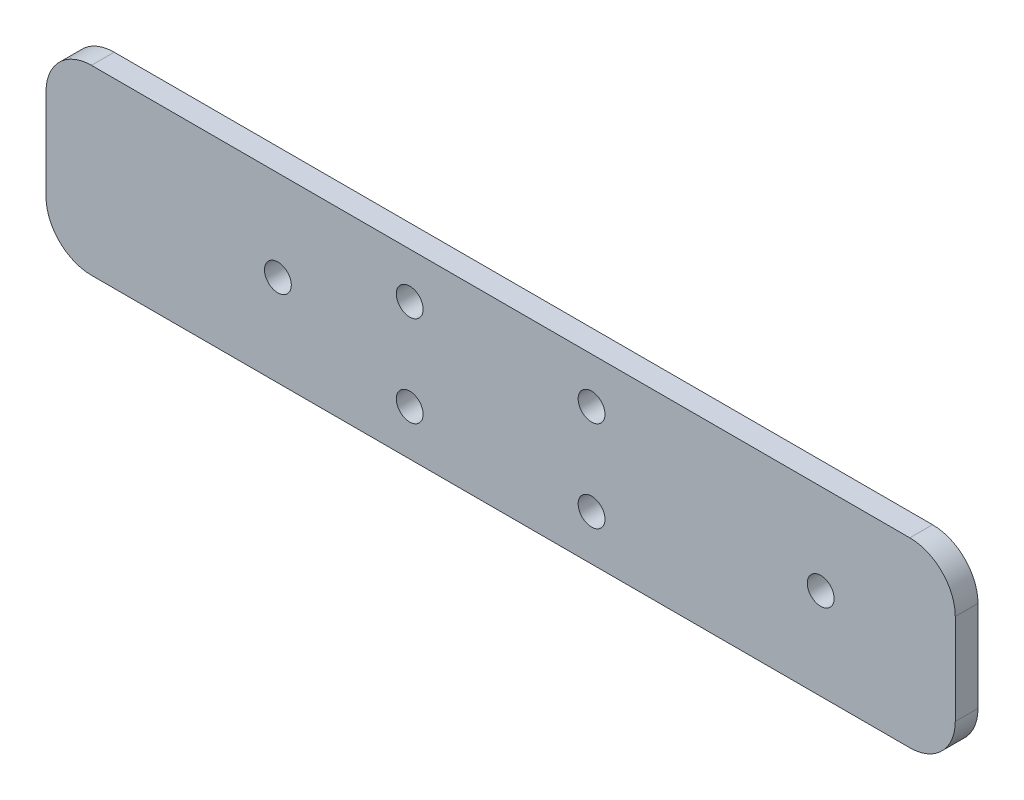
ISO-10303-21;
HEADER;
FILE_DESCRIPTION(('STEP AP214'),'2;1');
FILE_NAME('part.step','',(''),(''),'','','');
FILE_SCHEMA(('AUTOMOTIVE_DESIGN { 1 0 10303 214 1 1 1 1 }'));
ENDSEC;
DATA;
#1=APPLICATION_CONTEXT('core data for automotive mechanical design processes');
#2=APPLICATION_PROTOCOL_DEFINITION('international standard','automotive_design',2000,#1);
#3=PRODUCT_CONTEXT('',#1,'mechanical');
#4=PRODUCT('Part','Part','',(#3));
#5=PRODUCT_RELATED_PRODUCT_CATEGORY('part','',(#4));
#6=PRODUCT_DEFINITION_FORMATION('','',#4);
#7=PRODUCT_DEFINITION_CONTEXT('part definition',#1,'design');
#8=PRODUCT_DEFINITION('design','',#6,#7);
#9=PRODUCT_DEFINITION_SHAPE('','',#8);
#10=(LENGTH_UNIT() NAMED_UNIT(*) SI_UNIT(.MILLI.,.METRE.));
#11=(NAMED_UNIT(*) PLANE_ANGLE_UNIT() SI_UNIT($,.RADIAN.));
#12=(NAMED_UNIT(*) SI_UNIT($,.STERADIAN.) SOLID_ANGLE_UNIT());
#13=UNCERTAINTY_MEASURE_WITH_UNIT(LENGTH_MEASURE(1.E-05),#10,'distance_accuracy_value','');
#14=(GEOMETRIC_REPRESENTATION_CONTEXT(3) GLOBAL_UNCERTAINTY_ASSIGNED_CONTEXT((#13)) GLOBAL_UNIT_ASSIGNED_CONTEXT((#10,
#11,#12)) REPRESENTATION_CONTEXT('',''));
#15=CARTESIAN_POINT('',(0.,0.,0.));
#16=DIRECTION('',(0.,0.,1.));
#17=DIRECTION('',(1.,0.,0.));
#18=AXIS2_PLACEMENT_3D('',#15,#16,#17);
#19=CARTESIAN_POINT('',(74.9999999999999,15.,2.5));
#20=DIRECTION('',(0.,-1.,0.));
#21=DIRECTION('',(0.,0.,-1.));
#22=AXIS2_PLACEMENT_3D('',#19,#20,#21);
#23=PLANE('',#22);
#24=DIRECTION('',(-1.,0.,0.));
#25=VECTOR('',#24,1.);
#26=CARTESIAN_POINT('',(74.9999999999999,15.,2.5));
#27=LINE('',#26,#25);
#28=CARTESIAN_POINT('',(64.9999999999999,15.,2.5));
#29=VERTEX_POINT('',#28);
#30=CARTESIAN_POINT('',(-115.,15.,2.5));
#31=VERTEX_POINT('',#30);
#32=EDGE_CURVE('E129',#29,#31,#27,.T.);
#33=ORIENTED_EDGE('',*,*,#32,.F.);
#34=DIRECTION('',(0.,0.,-1.));
#35=VECTOR('',#34,1.);
#36=CARTESIAN_POINT('',(64.9999999999999,15.,2.5));
#37=LINE('',#36,#35);
#38=CARTESIAN_POINT('',(64.9999999999999,15.,-2.5));
#39=VERTEX_POINT('',#38);
#40=EDGE_CURVE('E11',#29,#39,#37,.T.);
#41=ORIENTED_EDGE('',*,*,#40,.T.);
#42=DIRECTION('',(-1.,0.,0.));
#43=VECTOR('',#42,1.);
#44=CARTESIAN_POINT('',(74.9999999999999,15.,-2.5));
#45=LINE('',#44,#43);
#46=CARTESIAN_POINT('',(-115.,15.,-2.5));
#47=VERTEX_POINT('',#46);
#48=EDGE_CURVE('E131',#39,#47,#45,.T.);
#49=ORIENTED_EDGE('',*,*,#48,.T.);
#50=DIRECTION('',(0.,0.,-1.));
#51=VECTOR('',#50,1.);
#52=CARTESIAN_POINT('',(-115.,15.,2.5));
#53=LINE('',#52,#51);
#54=EDGE_CURVE('E41',#47,#31,#53,.F.);
#55=ORIENTED_EDGE('',*,*,#54,.T.);
#56=EDGE_LOOP('',(#33,#41,#49,#55));
#57=FACE_BOUND('',#56,.T.);
#58=ADVANCED_FACE('F32',(#57),#23,.F.);
#59=CARTESIAN_POINT('',(-125.,-25.,2.5));
#60=DIRECTION('',(1.,0.,0.));
#61=DIRECTION('',(0.,1.,0.));
#62=AXIS2_PLACEMENT_3D('',#59,#60,#61);
#63=PLANE('',#62);
#64=DIRECTION('',(0.,-1.,0.));
#65=VECTOR('',#64,1.);
#66=CARTESIAN_POINT('',(-125.,-25.,-2.5));
#67=LINE('',#66,#65);
#68=CARTESIAN_POINT('',(-125.,4.99999999999997,-2.5));
#69=VERTEX_POINT('',#68);
#70=CARTESIAN_POINT('',(-125.,-15.,-2.5));
#71=VERTEX_POINT('',#70);
#72=EDGE_CURVE('E127',#69,#71,#67,.T.);
#73=ORIENTED_EDGE('',*,*,#72,.T.);
#74=DIRECTION('',(0.,0.,-1.));
#75=VECTOR('',#74,1.);
#76=CARTESIAN_POINT('',(-125.,-15.,2.5));
#77=LINE('',#76,#75);
#78=CARTESIAN_POINT('',(-125.,-15.,2.5));
#79=VERTEX_POINT('',#78);
#80=EDGE_CURVE('E106',#71,#79,#77,.F.);
#81=ORIENTED_EDGE('',*,*,#80,.T.);
#82=DIRECTION('',(0.,-1.,0.));
#83=VECTOR('',#82,1.);
#84=CARTESIAN_POINT('',(-125.,-25.,2.5));
#85=LINE('',#84,#83);
#86=CARTESIAN_POINT('',(-125.,4.99999999999997,2.5));
#87=VERTEX_POINT('',#86);
#88=EDGE_CURVE('E194',#87,#79,#85,.T.);
#89=ORIENTED_EDGE('',*,*,#88,.F.);
#90=DIRECTION('',(0.,0.,-1.));
#91=VECTOR('',#90,1.);
#92=CARTESIAN_POINT('',(-125.,4.99999999999997,2.5));
#93=LINE('',#92,#91);
#94=EDGE_CURVE('E111',#87,#69,#93,.T.);
#95=ORIENTED_EDGE('',*,*,#94,.T.);
#96=EDGE_LOOP('',(#73,#81,#89,#95));
#97=FACE_BOUND('',#96,.T.);
#98=ADVANCED_FACE('F210',(#97),#63,.F.);
#99=CARTESIAN_POINT('',(75.,-25.,2.5));
#100=DIRECTION('',(0.,1.,0.));
#101=DIRECTION('',(0.,0.,1.));
#102=AXIS2_PLACEMENT_3D('',#99,#100,#101);
#103=PLANE('',#102);
#104=DIRECTION('',(1.,0.,0.));
#105=VECTOR('',#104,1.);
#106=CARTESIAN_POINT('',(75.,-25.,2.5));
#107=LINE('',#106,#105);
#108=CARTESIAN_POINT('',(-115.,-25.,2.5));
#109=VERTEX_POINT('',#108);
#110=CARTESIAN_POINT('',(65.,-25.,2.5));
#111=VERTEX_POINT('',#110);
#112=EDGE_CURVE('E120',#109,#111,#107,.T.);
#113=ORIENTED_EDGE('',*,*,#112,.F.);
#114=DIRECTION('',(0.,0.,-1.));
#115=VECTOR('',#114,1.);
#116=CARTESIAN_POINT('',(-115.,-25.,2.5));
#117=LINE('',#116,#115);
#118=CARTESIAN_POINT('',(-115.,-25.,-2.5));
#119=VERTEX_POINT('',#118);
#120=EDGE_CURVE('E105',#109,#119,#117,.T.);
#121=ORIENTED_EDGE('',*,*,#120,.T.);
#122=DIRECTION('',(1.,0.,0.));
#123=VECTOR('',#122,1.);
#124=CARTESIAN_POINT('',(75.,-25.,-2.5));
#125=LINE('',#124,#123);
#126=CARTESIAN_POINT('',(65.,-25.,-2.5));
#127=VERTEX_POINT('',#126);
#128=EDGE_CURVE('E118',#119,#127,#125,.T.);
#129=ORIENTED_EDGE('',*,*,#128,.T.);
#130=DIRECTION('',(0.,0.,-1.));
#131=VECTOR('',#130,1.);
#132=CARTESIAN_POINT('',(65.,-25.,2.5));
#133=LINE('',#132,#131);
#134=EDGE_CURVE('E122',#127,#111,#133,.F.);
#135=ORIENTED_EDGE('',*,*,#134,.T.);
#136=EDGE_LOOP('',(#113,#121,#129,#135));
#137=FACE_BOUND('',#136,.T.);
#138=ADVANCED_FACE('F117',(#137),#103,.F.);
#139=CARTESIAN_POINT('',(75.,-25.,2.5));
#140=DIRECTION('',(-1.,0.,0.));
#141=DIRECTION('',(0.,-1.,0.));
#142=AXIS2_PLACEMENT_3D('',#139,#140,#141);
#143=PLANE('',#142);
#144=DIRECTION('',(0.,1.,0.));
#145=VECTOR('',#144,1.);
#146=CARTESIAN_POINT('',(75.,-25.,2.5));
#147=LINE('',#146,#145);
#148=CARTESIAN_POINT('',(75.,-15.,2.5));
#149=VERTEX_POINT('',#148);
#150=CARTESIAN_POINT('',(74.9999999999999,5.,2.5));
#151=VERTEX_POINT('',#150);
#152=EDGE_CURVE('E135',#149,#151,#147,.T.);
#153=ORIENTED_EDGE('',*,*,#152,.F.);
#154=DIRECTION('',(0.,0.,-1.));
#155=VECTOR('',#154,1.);
#156=CARTESIAN_POINT('',(75.,-15.,2.5));
#157=LINE('',#156,#155);
#158=CARTESIAN_POINT('',(75.,-15.,-2.5));
#159=VERTEX_POINT('',#158);
#160=EDGE_CURVE('E152',#149,#159,#157,.T.);
#161=ORIENTED_EDGE('',*,*,#160,.T.);
#162=DIRECTION('',(0.,1.,0.));
#163=VECTOR('',#162,1.);
#164=CARTESIAN_POINT('',(75.,-25.,-2.5));
#165=LINE('',#164,#163);
#166=CARTESIAN_POINT('',(74.9999999999999,5.,-2.5));
#167=VERTEX_POINT('',#166);
#168=EDGE_CURVE('E126',#159,#167,#165,.T.);
#169=ORIENTED_EDGE('',*,*,#168,.T.);
#170=DIRECTION('',(0.,0.,-1.));
#171=VECTOR('',#170,1.);
#172=CARTESIAN_POINT('',(74.9999999999999,5.,2.5));
#173=LINE('',#172,#171);
#174=EDGE_CURVE('E49',#167,#151,#173,.F.);
#175=ORIENTED_EDGE('',*,*,#174,.T.);
#176=EDGE_LOOP('',(#153,#161,#169,#175));
#177=FACE_BOUND('',#176,.T.);
#178=ADVANCED_FACE('F217',(#177),#143,.F.);
#179=CARTESIAN_POINT('',(-125.,15.,2.5));
#180=DIRECTION('',(0.,0.,-1.));
#181=DIRECTION('',(-1.,0.,0.));
#182=AXIS2_PLACEMENT_3D('',#179,#180,#181);
#183=PLANE('',#182);
#184=CARTESIAN_POINT('',(45.4004897084704,-4.90303524958086,2.5));
#185=DIRECTION('',(0.,0.,1.));
#186=DIRECTION('',(1.,0.,0.));
#187=AXIS2_PLACEMENT_3D('',#184,#185,#186);
#188=CIRCLE('',#187,2.95);
#189=CARTESIAN_POINT('',(48.3504897084704,-4.90303524958086,2.5));
#190=VERTEX_POINT('',#189);
#191=EDGE_CURVE('E180',#190,#190,#188,.T.);
#192=ORIENTED_EDGE('',*,*,#191,.F.);
#193=EDGE_LOOP('',(#192));
#194=FACE_BOUND('',#193,.T.);
#195=CARTESIAN_POINT('',(-5.00000000000011,-14.9999999999999,2.5));
#196=DIRECTION('',(0.,0.,1.));
#197=DIRECTION('',(1.,0.,0.));
#198=AXIS2_PLACEMENT_3D('',#195,#196,#197);
#199=CIRCLE('',#198,2.95);
#200=CARTESIAN_POINT('',(-2.0500000000001,-14.9999999999999,2.5));
#201=VERTEX_POINT('',#200);
#202=EDGE_CURVE('E170',#201,#201,#199,.T.);
#203=ORIENTED_EDGE('',*,*,#202,.F.);
#204=EDGE_LOOP('',(#203));
#205=FACE_BOUND('',#204,.T.);
#206=CARTESIAN_POINT('',(-45.,-14.9999999999999,2.5));
#207=DIRECTION('',(0.,0.,1.));
#208=DIRECTION('',(1.,0.,0.));
#209=AXIS2_PLACEMENT_3D('',#206,#207,#208);
#210=CIRCLE('',#209,2.95);
#211=CARTESIAN_POINT('',(-42.05,-14.9999999999999,2.5));
#212=VERTEX_POINT('',#211);
#213=EDGE_CURVE('E167',#212,#212,#210,.T.);
#214=ORIENTED_EDGE('',*,*,#213,.F.);
#215=EDGE_LOOP('',(#214));
#216=FACE_BOUND('',#215,.T.);
#217=CARTESIAN_POINT('',(-5.0000000000001,5.00000000000012,2.5));
#218=DIRECTION('',(0.,0.,1.));
#219=DIRECTION('',(1.,0.,0.));
#220=AXIS2_PLACEMENT_3D('',#217,#218,#219);
#221=CIRCLE('',#220,2.95);
#222=CARTESIAN_POINT('',(-2.0500000000001,5.00000000000012,2.5));
#223=VERTEX_POINT('',#222);
#224=EDGE_CURVE('E164',#223,#223,#221,.T.);
#225=ORIENTED_EDGE('',*,*,#224,.F.);
#226=EDGE_LOOP('',(#225));
#227=FACE_BOUND('',#226,.T.);
#228=CARTESIAN_POINT('',(-45.0000000000001,5.00000000000012,2.5));
#229=DIRECTION('',(0.,0.,1.));
#230=DIRECTION('',(1.,0.,0.));
#231=AXIS2_PLACEMENT_3D('',#228,#229,#230);
#232=CIRCLE('',#231,2.95);
#233=CARTESIAN_POINT('',(-42.05,5.00000000000012,2.5));
#234=VERTEX_POINT('',#233);
#235=EDGE_CURVE('E160',#234,#234,#232,.T.);
#236=ORIENTED_EDGE('',*,*,#235,.F.);
#237=EDGE_LOOP('',(#236));
#238=FACE_BOUND('',#237,.T.);
#239=CARTESIAN_POINT('',(-73.9995102915293,-4.90303524958051,2.5));
#240=DIRECTION('',(0.,0.,-1.));
#241=DIRECTION('',(-1.,0.,0.));
#242=AXIS2_PLACEMENT_3D('',#239,#240,#241);
#243=CIRCLE('',#242,2.95);
#244=CARTESIAN_POINT('',(-76.9495102915293,-4.90303524958051,2.5));
#245=VERTEX_POINT('',#244);
#246=EDGE_CURVE('E189',#245,#245,#243,.T.);
#247=ORIENTED_EDGE('',*,*,#246,.T.);
#248=EDGE_LOOP('',(#247));
#249=FACE_BOUND('',#248,.T.);
#250=ORIENTED_EDGE('',*,*,#88,.T.);
#251=CARTESIAN_POINT('',(-115.,-15.,2.5));
#252=DIRECTION('',(0.,0.,-1.));
#253=DIRECTION('',(-1.,0.,0.));
#254=AXIS2_PLACEMENT_3D('',#251,#252,#253);
#255=CIRCLE('',#254,10.);
#256=EDGE_CURVE('E149',#79,#109,#255,.F.);
#257=ORIENTED_EDGE('',*,*,#256,.T.);
#258=ORIENTED_EDGE('',*,*,#112,.T.);
#259=CARTESIAN_POINT('',(65.,-15.,2.5));
#260=DIRECTION('',(0.,0.,-1.));
#261=DIRECTION('',(-1.,0.,0.));
#262=AXIS2_PLACEMENT_3D('',#259,#260,#261);
#263=CIRCLE('',#262,10.);
#264=EDGE_CURVE('E56',#111,#149,#263,.F.);
#265=ORIENTED_EDGE('',*,*,#264,.T.);
#266=ORIENTED_EDGE('',*,*,#152,.T.);
#267=CARTESIAN_POINT('',(64.9999999999999,5.,2.5));
#268=DIRECTION('',(0.,0.,-1.));
#269=DIRECTION('',(-1.,0.,0.));
#270=AXIS2_PLACEMENT_3D('',#267,#268,#269);
#271=CIRCLE('',#270,10.);
#272=EDGE_CURVE('E146',#151,#29,#271,.F.);
#273=ORIENTED_EDGE('',*,*,#272,.T.);
#274=ORIENTED_EDGE('',*,*,#32,.T.);
#275=CARTESIAN_POINT('',(-115.,5.,2.5));
#276=DIRECTION('',(0.,0.,-1.));
#277=DIRECTION('',(-1.,0.,0.));
#278=AXIS2_PLACEMENT_3D('',#275,#276,#277);
#279=CIRCLE('',#278,10.);
#280=EDGE_CURVE('E144',#31,#87,#279,.F.);
#281=ORIENTED_EDGE('',*,*,#280,.T.);
#282=EDGE_LOOP('',(#250,#257,#258,#265,#266,#273,#274,#281));
#283=FACE_BOUND('',#282,.T.);
#284=ADVANCED_FACE('F208',(#194,#205,#216,#227,#238,#249,#283),#183,.F.);
#285=CARTESIAN_POINT('',(-125.,15.,-2.5));
#286=DIRECTION('',(0.,0.,-1.));
#287=DIRECTION('',(-1.,0.,0.));
#288=AXIS2_PLACEMENT_3D('',#285,#286,#287);
#289=PLANE('',#288);
#290=CARTESIAN_POINT('',(45.4004897084704,-4.90303524958086,-2.5));
#291=DIRECTION('',(0.,0.,-1.));
#292=DIRECTION('',(-1.,0.,0.));
#293=AXIS2_PLACEMENT_3D('',#290,#291,#292);
#294=CIRCLE('',#293,2.95);
#295=CARTESIAN_POINT('',(42.4504897084704,-4.90303524958086,-2.5));
#296=VERTEX_POINT('',#295);
#297=EDGE_CURVE('E36',#296,#296,#294,.T.);
#298=ORIENTED_EDGE('',*,*,#297,.F.);
#299=EDGE_LOOP('',(#298));
#300=FACE_BOUND('',#299,.T.);
#301=CARTESIAN_POINT('',(-5.00000000000011,-14.9999999999999,-2.5));
#302=DIRECTION('',(0.,0.,-1.));
#303=DIRECTION('',(-1.,0.,0.));
#304=AXIS2_PLACEMENT_3D('',#301,#302,#303);
#305=CIRCLE('',#304,2.95);
#306=CARTESIAN_POINT('',(-7.95000000000011,-14.9999999999999,-2.5));
#307=VERTEX_POINT('',#306);
#308=EDGE_CURVE('E168',#307,#307,#305,.T.);
#309=ORIENTED_EDGE('',*,*,#308,.F.);
#310=EDGE_LOOP('',(#309));
#311=FACE_BOUND('',#310,.T.);
#312=CARTESIAN_POINT('',(-45.,-14.9999999999999,-2.5));
#313=DIRECTION('',(0.,0.,-1.));
#314=DIRECTION('',(-1.,0.,0.));
#315=AXIS2_PLACEMENT_3D('',#312,#313,#314);
#316=CIRCLE('',#315,2.95);
#317=CARTESIAN_POINT('',(-47.95,-14.9999999999999,-2.5));
#318=VERTEX_POINT('',#317);
#319=EDGE_CURVE('E165',#318,#318,#316,.T.);
#320=ORIENTED_EDGE('',*,*,#319,.F.);
#321=EDGE_LOOP('',(#320));
#322=FACE_BOUND('',#321,.T.);
#323=CARTESIAN_POINT('',(-5.0000000000001,5.00000000000012,-2.5));
#324=DIRECTION('',(0.,0.,-1.));
#325=DIRECTION('',(-1.,0.,0.));
#326=AXIS2_PLACEMENT_3D('',#323,#324,#325);
#327=CIRCLE('',#326,2.95);
#328=CARTESIAN_POINT('',(-7.95000000000011,5.00000000000012,-2.5));
#329=VERTEX_POINT('',#328);
#330=EDGE_CURVE('E161',#329,#329,#327,.T.);
#331=ORIENTED_EDGE('',*,*,#330,.F.);
#332=EDGE_LOOP('',(#331));
#333=FACE_BOUND('',#332,.T.);
#334=CARTESIAN_POINT('',(-45.0000000000001,5.00000000000012,-2.5));
#335=DIRECTION('',(0.,0.,-1.));
#336=DIRECTION('',(-1.,0.,0.));
#337=AXIS2_PLACEMENT_3D('',#334,#335,#336);
#338=CIRCLE('',#337,2.95);
#339=CARTESIAN_POINT('',(-47.9500000000001,5.00000000000012,-2.5));
#340=VERTEX_POINT('',#339);
#341=EDGE_CURVE('E156',#340,#340,#338,.T.);
#342=ORIENTED_EDGE('',*,*,#341,.F.);
#343=EDGE_LOOP('',(#342));
#344=FACE_BOUND('',#343,.T.);
#345=CARTESIAN_POINT('',(-73.9995102915293,-4.90303524958051,-2.5));
#346=DIRECTION('',(0.,0.,-1.));
#347=DIRECTION('',(-1.,0.,0.));
#348=AXIS2_PLACEMENT_3D('',#345,#346,#347);
#349=CIRCLE('',#348,2.95);
#350=CARTESIAN_POINT('',(-76.9495102915293,-4.90303524958051,-2.5));
#351=VERTEX_POINT('',#350);
#352=EDGE_CURVE('E159',#351,#351,#349,.T.);
#353=ORIENTED_EDGE('',*,*,#352,.F.);
#354=EDGE_LOOP('',(#353));
#355=FACE_BOUND('',#354,.T.);
#356=ORIENTED_EDGE('',*,*,#128,.F.);
#357=CARTESIAN_POINT('',(-115.,-15.,-2.5));
#358=DIRECTION('',(0.,0.,-1.));
#359=DIRECTION('',(-1.,0.,0.));
#360=AXIS2_PLACEMENT_3D('',#357,#358,#359);
#361=CIRCLE('',#360,10.);
#362=EDGE_CURVE('E101',#119,#71,#361,.T.);
#363=ORIENTED_EDGE('',*,*,#362,.T.);
#364=ORIENTED_EDGE('',*,*,#72,.F.);
#365=CARTESIAN_POINT('',(-115.,5.,-2.5));
#366=DIRECTION('',(0.,0.,-1.));
#367=DIRECTION('',(-1.,0.,0.));
#368=AXIS2_PLACEMENT_3D('',#365,#366,#367);
#369=CIRCLE('',#368,10.);
#370=EDGE_CURVE('E121',#69,#47,#369,.T.);
#371=ORIENTED_EDGE('',*,*,#370,.T.);
#372=ORIENTED_EDGE('',*,*,#48,.F.);
#373=CARTESIAN_POINT('',(64.9999999999999,5.,-2.5));
#374=DIRECTION('',(0.,0.,-1.));
#375=DIRECTION('',(-1.,0.,0.));
#376=AXIS2_PLACEMENT_3D('',#373,#374,#375);
#377=CIRCLE('',#376,10.);
#378=EDGE_CURVE('E138',#39,#167,#377,.T.);
#379=ORIENTED_EDGE('',*,*,#378,.T.);
#380=ORIENTED_EDGE('',*,*,#168,.F.);
#381=CARTESIAN_POINT('',(65.,-15.,-2.5));
#382=DIRECTION('',(0.,0.,-1.));
#383=DIRECTION('',(-1.,0.,0.));
#384=AXIS2_PLACEMENT_3D('',#381,#382,#383);
#385=CIRCLE('',#384,10.);
#386=EDGE_CURVE('E112',#159,#127,#385,.T.);
#387=ORIENTED_EDGE('',*,*,#386,.T.);
#388=EDGE_LOOP('',(#356,#363,#364,#371,#372,#379,#380,#387));
#389=FACE_BOUND('',#388,.T.);
#390=ADVANCED_FACE('F124',(#300,#311,#322,#333,#344,#355,#389),#289,.T.);
#391=CARTESIAN_POINT('',(-115.,-15.,2.5));
#392=DIRECTION('',(0.,0.,-1.));
#393=DIRECTION('',(-1.,0.,0.));
#394=AXIS2_PLACEMENT_3D('',#391,#392,#393);
#395=CYLINDRICAL_SURFACE('',#394,10.);
#396=ORIENTED_EDGE('',*,*,#256,.F.);
#397=ORIENTED_EDGE('',*,*,#80,.F.);
#398=ORIENTED_EDGE('',*,*,#362,.F.);
#399=ORIENTED_EDGE('',*,*,#120,.F.);
#400=EDGE_LOOP('',(#396,#397,#398,#399));
#401=FACE_BOUND('',#400,.T.);
#402=ADVANCED_FACE('F104',(#401),#395,.T.);
#403=CARTESIAN_POINT('',(65.,-15.,2.5));
#404=DIRECTION('',(0.,0.,-1.));
#405=DIRECTION('',(-1.,0.,0.));
#406=AXIS2_PLACEMENT_3D('',#403,#404,#405);
#407=CYLINDRICAL_SURFACE('',#406,10.);
#408=ORIENTED_EDGE('',*,*,#264,.F.);
#409=ORIENTED_EDGE('',*,*,#134,.F.);
#410=ORIENTED_EDGE('',*,*,#386,.F.);
#411=ORIENTED_EDGE('',*,*,#160,.F.);
#412=EDGE_LOOP('',(#408,#409,#410,#411));
#413=FACE_BOUND('',#412,.T.);
#414=ADVANCED_FACE('F224',(#413),#407,.T.);
#415=CARTESIAN_POINT('',(64.9999999999999,5.,2.5));
#416=DIRECTION('',(0.,0.,-1.));
#417=DIRECTION('',(-1.,0.,0.));
#418=AXIS2_PLACEMENT_3D('',#415,#416,#417);
#419=CYLINDRICAL_SURFACE('',#418,10.);
#420=ORIENTED_EDGE('',*,*,#272,.F.);
#421=ORIENTED_EDGE('',*,*,#174,.F.);
#422=ORIENTED_EDGE('',*,*,#378,.F.);
#423=ORIENTED_EDGE('',*,*,#40,.F.);
#424=EDGE_LOOP('',(#420,#421,#422,#423));
#425=FACE_BOUND('',#424,.T.);
#426=ADVANCED_FACE('F226',(#425),#419,.T.);
#427=CARTESIAN_POINT('',(-115.,5.,2.5));
#428=DIRECTION('',(0.,0.,-1.));
#429=DIRECTION('',(-1.,0.,0.));
#430=AXIS2_PLACEMENT_3D('',#427,#428,#429);
#431=CYLINDRICAL_SURFACE('',#430,10.);
#432=ORIENTED_EDGE('',*,*,#280,.F.);
#433=ORIENTED_EDGE('',*,*,#54,.F.);
#434=ORIENTED_EDGE('',*,*,#370,.F.);
#435=ORIENTED_EDGE('',*,*,#94,.F.);
#436=EDGE_LOOP('',(#432,#433,#434,#435));
#437=FACE_BOUND('',#436,.T.);
#438=ADVANCED_FACE('F34',(#437),#431,.T.);
#439=CARTESIAN_POINT('',(-73.9995102915293,-4.90303524958051,7.5));
#440=DIRECTION('',(0.,0.,-1.));
#441=DIRECTION('',(-1.,0.,0.));
#442=AXIS2_PLACEMENT_3D('',#439,#440,#441);
#443=CYLINDRICAL_SURFACE('',#442,2.95);
#444=ORIENTED_EDGE('',*,*,#352,.T.);
#445=EDGE_LOOP('',(#444));
#446=FACE_BOUND('',#445,.T.);
#447=ORIENTED_EDGE('',*,*,#246,.F.);
#448=EDGE_LOOP('',(#447));
#449=FACE_BOUND('',#448,.T.);
#450=ADVANCED_FACE('F233',(#446,#449),#443,.F.);
#451=CARTESIAN_POINT('',(-45.0000000000001,5.00000000000012,-7.5));
#452=DIRECTION('',(0.,0.,1.));
#453=DIRECTION('',(1.,0.,0.));
#454=AXIS2_PLACEMENT_3D('',#451,#452,#453);
#455=CYLINDRICAL_SURFACE('',#454,2.95);
#456=ORIENTED_EDGE('',*,*,#341,.T.);
#457=EDGE_LOOP('',(#456));
#458=FACE_BOUND('',#457,.T.);
#459=ORIENTED_EDGE('',*,*,#235,.T.);
#460=EDGE_LOOP('',(#459));
#461=FACE_BOUND('',#460,.T.);
#462=ADVANCED_FACE('F248',(#458,#461),#455,.F.);
#463=CARTESIAN_POINT('',(-5.0000000000001,5.00000000000012,-7.5));
#464=DIRECTION('',(0.,0.,1.));
#465=DIRECTION('',(1.,0.,0.));
#466=AXIS2_PLACEMENT_3D('',#463,#464,#465);
#467=CYLINDRICAL_SURFACE('',#466,2.95);
#468=ORIENTED_EDGE('',*,*,#330,.T.);
#469=EDGE_LOOP('',(#468));
#470=FACE_BOUND('',#469,.T.);
#471=ORIENTED_EDGE('',*,*,#224,.T.);
#472=EDGE_LOOP('',(#471));
#473=FACE_BOUND('',#472,.T.);
#474=ADVANCED_FACE('F252',(#470,#473),#467,.F.);
#475=CARTESIAN_POINT('',(-45.,-14.9999999999999,-7.5));
#476=DIRECTION('',(0.,0.,1.));
#477=DIRECTION('',(1.,0.,0.));
#478=AXIS2_PLACEMENT_3D('',#475,#476,#477);
#479=CYLINDRICAL_SURFACE('',#478,2.95);
#480=ORIENTED_EDGE('',*,*,#319,.T.);
#481=EDGE_LOOP('',(#480));
#482=FACE_BOUND('',#481,.T.);
#483=ORIENTED_EDGE('',*,*,#213,.T.);
#484=EDGE_LOOP('',(#483));
#485=FACE_BOUND('',#484,.T.);
#486=ADVANCED_FACE('F256',(#482,#485),#479,.F.);
#487=CARTESIAN_POINT('',(-5.00000000000011,-14.9999999999999,-7.5));
#488=DIRECTION('',(0.,0.,1.));
#489=DIRECTION('',(1.,0.,0.));
#490=AXIS2_PLACEMENT_3D('',#487,#488,#489);
#491=CYLINDRICAL_SURFACE('',#490,2.95);
#492=ORIENTED_EDGE('',*,*,#308,.T.);
#493=EDGE_LOOP('',(#492));
#494=FACE_BOUND('',#493,.T.);
#495=ORIENTED_EDGE('',*,*,#202,.T.);
#496=EDGE_LOOP('',(#495));
#497=FACE_BOUND('',#496,.T.);
#498=ADVANCED_FACE('F260',(#494,#497),#491,.F.);
#499=CARTESIAN_POINT('',(45.4004897084704,-4.90303524958086,-7.5));
#500=DIRECTION('',(0.,0.,1.));
#501=DIRECTION('',(1.,0.,0.));
#502=AXIS2_PLACEMENT_3D('',#499,#500,#501);
#503=CYLINDRICAL_SURFACE('',#502,2.95);
#504=ORIENTED_EDGE('',*,*,#297,.T.);
#505=EDGE_LOOP('',(#504));
#506=FACE_BOUND('',#505,.T.);
#507=ORIENTED_EDGE('',*,*,#191,.T.);
#508=EDGE_LOOP('',(#507));
#509=FACE_BOUND('',#508,.T.);
#510=ADVANCED_FACE('F264',(#506,#509),#503,.F.);
#511=CLOSED_SHELL('',(#58,#98,#138,#178,#284,#390,#402,#414,#426,#438,#450,#462,#474,#486,#498,#510));
#512=MANIFOLD_SOLID_BREP('B2',#511);
#513=ADVANCED_BREP_SHAPE_REPRESENTATION('',(#18,#512),#14);
#514=SHAPE_DEFINITION_REPRESENTATION(#9,#513);
ENDSEC;
END-ISO-10303-21;
